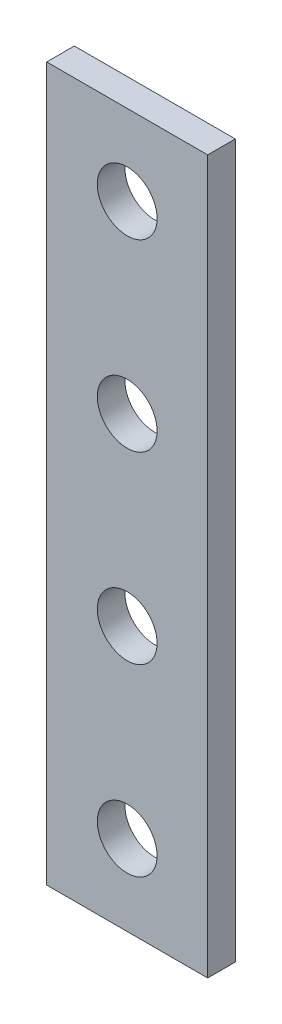
ISO-10303-21;
HEADER;
FILE_DESCRIPTION(('STEP AP214'),'2;1');
FILE_NAME('part.step','',(''),(''),'','','');
FILE_SCHEMA(('AUTOMOTIVE_DESIGN { 1 0 10303 214 1 1 1 1 }'));
ENDSEC;
DATA;
#1=APPLICATION_CONTEXT('core data for automotive mechanical design processes');
#2=APPLICATION_PROTOCOL_DEFINITION('international standard','automotive_design',2000,#1);
#3=PRODUCT_CONTEXT('',#1,'mechanical');
#4=PRODUCT('Part','Part','',(#3));
#5=PRODUCT_RELATED_PRODUCT_CATEGORY('part','',(#4));
#6=PRODUCT_DEFINITION_FORMATION('','',#4);
#7=PRODUCT_DEFINITION_CONTEXT('part definition',#1,'design');
#8=PRODUCT_DEFINITION('design','',#6,#7);
#9=PRODUCT_DEFINITION_SHAPE('','',#8);
#10=(LENGTH_UNIT() NAMED_UNIT(*) SI_UNIT(.MILLI.,.METRE.));
#11=(NAMED_UNIT(*) PLANE_ANGLE_UNIT() SI_UNIT($,.RADIAN.));
#12=(NAMED_UNIT(*) SI_UNIT($,.STERADIAN.) SOLID_ANGLE_UNIT());
#13=UNCERTAINTY_MEASURE_WITH_UNIT(LENGTH_MEASURE(1.E-05),#10,'distance_accuracy_value','');
#14=(GEOMETRIC_REPRESENTATION_CONTEXT(3) GLOBAL_UNCERTAINTY_ASSIGNED_CONTEXT((#13)) GLOBAL_UNIT_ASSIGNED_CONTEXT((#10,
#11,#12)) REPRESENTATION_CONTEXT('',''));
#15=CARTESIAN_POINT('',(0.,0.,0.));
#16=DIRECTION('',(0.,0.,1.));
#17=DIRECTION('',(1.,0.,0.));
#18=AXIS2_PLACEMENT_3D('',#15,#16,#17);
#19=CARTESIAN_POINT('',(35.,155.,12.));
#20=DIRECTION('',(-1.,0.,0.));
#21=DIRECTION('',(0.,-1.,0.));
#22=AXIS2_PLACEMENT_3D('',#19,#20,#21);
#23=PLANE('',#22);
#24=DIRECTION('',(0.,1.,0.));
#25=VECTOR('',#24,1.);
#26=CARTESIAN_POINT('',(35.,155.,0.));
#27=LINE('',#26,#25);
#28=CARTESIAN_POINT('',(35.,-155.,0.));
#29=VERTEX_POINT('',#28);
#30=CARTESIAN_POINT('',(35.,155.,0.));
#31=VERTEX_POINT('',#30);
#32=EDGE_CURVE('E103',#29,#31,#27,.T.);
#33=ORIENTED_EDGE('',*,*,#32,.T.);
#34=DIRECTION('',(0.,0.,-1.));
#35=VECTOR('',#34,1.);
#36=CARTESIAN_POINT('',(35.,155.,12.));
#37=LINE('',#36,#35);
#38=CARTESIAN_POINT('',(35.,155.,12.));
#39=VERTEX_POINT('',#38);
#40=EDGE_CURVE('E94',#39,#31,#37,.T.);
#41=ORIENTED_EDGE('',*,*,#40,.F.);
#42=DIRECTION('',(0.,1.,0.));
#43=VECTOR('',#42,1.);
#44=CARTESIAN_POINT('',(35.,155.,12.));
#45=LINE('',#44,#43);
#46=CARTESIAN_POINT('',(35.,-155.,12.));
#47=VERTEX_POINT('',#46);
#48=EDGE_CURVE('E88',#47,#39,#45,.T.);
#49=ORIENTED_EDGE('',*,*,#48,.F.);
#50=DIRECTION('',(0.,0.,-1.));
#51=VECTOR('',#50,1.);
#52=CARTESIAN_POINT('',(35.,-155.,12.));
#53=LINE('',#52,#51);
#54=EDGE_CURVE('E99',#47,#29,#53,.T.);
#55=ORIENTED_EDGE('',*,*,#54,.T.);
#56=EDGE_LOOP('',(#33,#41,#49,#55));
#57=FACE_BOUND('',#56,.T.);
#58=ADVANCED_FACE('F34',(#57),#23,.F.);
#59=CARTESIAN_POINT('',(-35.,155.,12.));
#60=DIRECTION('',(0.,-1.,0.));
#61=DIRECTION('',(0.,0.,-1.));
#62=AXIS2_PLACEMENT_3D('',#59,#60,#61);
#63=PLANE('',#62);
#64=DIRECTION('',(-1.,0.,0.));
#65=VECTOR('',#64,1.);
#66=CARTESIAN_POINT('',(-35.,155.,0.));
#67=LINE('',#66,#65);
#68=CARTESIAN_POINT('',(-35.,155.,0.));
#69=VERTEX_POINT('',#68);
#70=EDGE_CURVE('E93',#31,#69,#67,.T.);
#71=ORIENTED_EDGE('',*,*,#70,.T.);
#72=DIRECTION('',(0.,0.,-1.));
#73=VECTOR('',#72,1.);
#74=CARTESIAN_POINT('',(-35.,155.,12.));
#75=LINE('',#74,#73);
#76=CARTESIAN_POINT('',(-35.,155.,12.));
#77=VERTEX_POINT('',#76);
#78=EDGE_CURVE('E91',#77,#69,#75,.T.);
#79=ORIENTED_EDGE('',*,*,#78,.F.);
#80=DIRECTION('',(-1.,0.,0.));
#81=VECTOR('',#80,1.);
#82=CARTESIAN_POINT('',(-35.,155.,12.));
#83=LINE('',#82,#81);
#84=EDGE_CURVE('E82',#39,#77,#83,.T.);
#85=ORIENTED_EDGE('',*,*,#84,.F.);
#86=ORIENTED_EDGE('',*,*,#40,.T.);
#87=EDGE_LOOP('',(#71,#79,#85,#86));
#88=FACE_BOUND('',#87,.T.);
#89=ADVANCED_FACE('F92',(#88),#63,.F.);
#90=CARTESIAN_POINT('',(-35.,155.,12.));
#91=DIRECTION('',(1.,0.,0.));
#92=DIRECTION('',(0.,1.,0.));
#93=AXIS2_PLACEMENT_3D('',#90,#91,#92);
#94=PLANE('',#93);
#95=DIRECTION('',(0.,-1.,0.));
#96=VECTOR('',#95,1.);
#97=CARTESIAN_POINT('',(-35.,155.,0.));
#98=LINE('',#97,#96);
#99=CARTESIAN_POINT('',(-35.,-155.,0.));
#100=VERTEX_POINT('',#99);
#101=EDGE_CURVE('E68',#69,#100,#98,.T.);
#102=ORIENTED_EDGE('',*,*,#101,.T.);
#103=DIRECTION('',(0.,0.,-1.));
#104=VECTOR('',#103,1.);
#105=CARTESIAN_POINT('',(-35.,-155.,12.));
#106=LINE('',#105,#104);
#107=CARTESIAN_POINT('',(-35.,-155.,12.));
#108=VERTEX_POINT('',#107);
#109=EDGE_CURVE('E95',#108,#100,#106,.T.);
#110=ORIENTED_EDGE('',*,*,#109,.F.);
#111=DIRECTION('',(0.,-1.,0.));
#112=VECTOR('',#111,1.);
#113=CARTESIAN_POINT('',(-35.,155.,12.));
#114=LINE('',#113,#112);
#115=EDGE_CURVE('E86',#77,#108,#114,.T.);
#116=ORIENTED_EDGE('',*,*,#115,.F.);
#117=ORIENTED_EDGE('',*,*,#78,.T.);
#118=EDGE_LOOP('',(#102,#110,#116,#117));
#119=FACE_BOUND('',#118,.T.);
#120=ADVANCED_FACE('F97',(#119),#94,.F.);
#121=CARTESIAN_POINT('',(-35.,-155.,12.));
#122=DIRECTION('',(0.,1.,0.));
#123=DIRECTION('',(0.,0.,1.));
#124=AXIS2_PLACEMENT_3D('',#121,#122,#123);
#125=PLANE('',#124);
#126=DIRECTION('',(1.,0.,0.));
#127=VECTOR('',#126,1.);
#128=CARTESIAN_POINT('',(-35.,-155.,0.));
#129=LINE('',#128,#127);
#130=EDGE_CURVE('E74',#100,#29,#129,.T.);
#131=ORIENTED_EDGE('',*,*,#130,.T.);
#132=ORIENTED_EDGE('',*,*,#54,.F.);
#133=DIRECTION('',(1.,0.,0.));
#134=VECTOR('',#133,1.);
#135=CARTESIAN_POINT('',(-35.,-155.,12.));
#136=LINE('',#135,#134);
#137=EDGE_CURVE('E51',#108,#47,#136,.T.);
#138=ORIENTED_EDGE('',*,*,#137,.F.);
#139=ORIENTED_EDGE('',*,*,#109,.T.);
#140=EDGE_LOOP('',(#131,#132,#138,#139));
#141=FACE_BOUND('',#140,.T.);
#142=ADVANCED_FACE('F129',(#141),#125,.F.);
#143=CARTESIAN_POINT('',(35.,-155.,12.));
#144=DIRECTION('',(0.,0.,1.));
#145=DIRECTION('',(1.,0.,0.));
#146=AXIS2_PLACEMENT_3D('',#143,#144,#145);
#147=PLANE('',#146);
#148=CARTESIAN_POINT('',(0.,40.,12.));
#149=DIRECTION('',(0.,0.,1.));
#150=DIRECTION('',(1.,0.,0.));
#151=AXIS2_PLACEMENT_3D('',#148,#149,#150);
#152=CIRCLE('',#151,13.);
#153=CARTESIAN_POINT('',(13.,40.,12.));
#154=VERTEX_POINT('',#153);
#155=EDGE_CURVE('E172',#154,#154,#152,.T.);
#156=ORIENTED_EDGE('',*,*,#155,.F.);
#157=EDGE_LOOP('',(#156));
#158=FACE_BOUND('',#157,.T.);
#159=CARTESIAN_POINT('',(0.,120.,12.));
#160=DIRECTION('',(0.,0.,1.));
#161=DIRECTION('',(1.,0.,0.));
#162=AXIS2_PLACEMENT_3D('',#159,#160,#161);
#163=CIRCLE('',#162,13.);
#164=CARTESIAN_POINT('',(13.,120.,12.));
#165=VERTEX_POINT('',#164);
#166=EDGE_CURVE('E173',#165,#165,#163,.T.);
#167=ORIENTED_EDGE('',*,*,#166,.F.);
#168=EDGE_LOOP('',(#167));
#169=FACE_BOUND('',#168,.T.);
#170=ORIENTED_EDGE('',*,*,#48,.T.);
#171=ORIENTED_EDGE('',*,*,#84,.T.);
#172=ORIENTED_EDGE('',*,*,#115,.T.);
#173=ORIENTED_EDGE('',*,*,#137,.T.);
#174=EDGE_LOOP('',(#170,#171,#172,#173));
#175=FACE_BOUND('',#174,.T.);
#176=CARTESIAN_POINT('',(0.,-40.,12.));
#177=DIRECTION('',(0.,0.,1.));
#178=DIRECTION('',(1.,0.,0.));
#179=AXIS2_PLACEMENT_3D('',#176,#177,#178);
#180=CIRCLE('',#179,13.);
#181=CARTESIAN_POINT('',(13.,-40.,12.));
#182=VERTEX_POINT('',#181);
#183=EDGE_CURVE('E116',#182,#182,#180,.T.);
#184=ORIENTED_EDGE('',*,*,#183,.F.);
#185=EDGE_LOOP('',(#184));
#186=FACE_BOUND('',#185,.T.);
#187=CARTESIAN_POINT('',(0.,-120.,12.));
#188=DIRECTION('',(0.,0.,1.));
#189=DIRECTION('',(1.,0.,0.));
#190=AXIS2_PLACEMENT_3D('',#187,#188,#189);
#191=CIRCLE('',#190,13.);
#192=CARTESIAN_POINT('',(13.,-120.,12.));
#193=VERTEX_POINT('',#192);
#194=EDGE_CURVE('E11',#193,#193,#191,.T.);
#195=ORIENTED_EDGE('',*,*,#194,.F.);
#196=EDGE_LOOP('',(#195));
#197=FACE_BOUND('',#196,.T.);
#198=ADVANCED_FACE('F83',(#158,#169,#175,#186,#197),#147,.T.);
#199=CARTESIAN_POINT('',(35.,-155.,0.));
#200=DIRECTION('',(0.,0.,1.));
#201=DIRECTION('',(1.,0.,0.));
#202=AXIS2_PLACEMENT_3D('',#199,#200,#201);
#203=PLANE('',#202);
#204=CARTESIAN_POINT('',(0.,40.,0.));
#205=DIRECTION('',(0.,0.,1.));
#206=DIRECTION('',(1.,0.,0.));
#207=AXIS2_PLACEMENT_3D('',#204,#205,#206);
#208=CIRCLE('',#207,13.);
#209=CARTESIAN_POINT('',(13.,40.,0.));
#210=VERTEX_POINT('',#209);
#211=EDGE_CURVE('E170',#210,#210,#208,.T.);
#212=ORIENTED_EDGE('',*,*,#211,.T.);
#213=EDGE_LOOP('',(#212));
#214=FACE_BOUND('',#213,.T.);
#215=CARTESIAN_POINT('',(0.,120.,0.));
#216=DIRECTION('',(0.,0.,1.));
#217=DIRECTION('',(1.,0.,0.));
#218=AXIS2_PLACEMENT_3D('',#215,#216,#217);
#219=CIRCLE('',#218,13.);
#220=CARTESIAN_POINT('',(13.,120.,0.));
#221=VERTEX_POINT('',#220);
#222=EDGE_CURVE('E106',#221,#221,#219,.T.);
#223=ORIENTED_EDGE('',*,*,#222,.T.);
#224=EDGE_LOOP('',(#223));
#225=FACE_BOUND('',#224,.T.);
#226=ORIENTED_EDGE('',*,*,#32,.F.);
#227=ORIENTED_EDGE('',*,*,#130,.F.);
#228=ORIENTED_EDGE('',*,*,#101,.F.);
#229=ORIENTED_EDGE('',*,*,#70,.F.);
#230=EDGE_LOOP('',(#226,#227,#228,#229));
#231=FACE_BOUND('',#230,.T.);
#232=CARTESIAN_POINT('',(0.,-40.,0.));
#233=DIRECTION('',(0.,0.,1.));
#234=DIRECTION('',(1.,0.,0.));
#235=AXIS2_PLACEMENT_3D('',#232,#233,#234);
#236=CIRCLE('',#235,13.);
#237=CARTESIAN_POINT('',(13.,-40.,0.));
#238=VERTEX_POINT('',#237);
#239=EDGE_CURVE('E113',#238,#238,#236,.T.);
#240=ORIENTED_EDGE('',*,*,#239,.T.);
#241=EDGE_LOOP('',(#240));
#242=FACE_BOUND('',#241,.T.);
#243=CARTESIAN_POINT('',(0.,-120.,0.));
#244=DIRECTION('',(0.,0.,1.));
#245=DIRECTION('',(1.,0.,0.));
#246=AXIS2_PLACEMENT_3D('',#243,#244,#245);
#247=CIRCLE('',#246,13.);
#248=CARTESIAN_POINT('',(13.,-120.,0.));
#249=VERTEX_POINT('',#248);
#250=EDGE_CURVE('E43',#249,#249,#247,.T.);
#251=ORIENTED_EDGE('',*,*,#250,.T.);
#252=EDGE_LOOP('',(#251));
#253=FACE_BOUND('',#252,.T.);
#254=ADVANCED_FACE('F121',(#214,#225,#231,#242,#253),#203,.F.);
#255=CARTESIAN_POINT('',(0.,120.,0.));
#256=DIRECTION('',(0.,0.,1.));
#257=DIRECTION('',(1.,0.,0.));
#258=AXIS2_PLACEMENT_3D('',#255,#256,#257);
#259=CYLINDRICAL_SURFACE('',#258,13.);
#260=ORIENTED_EDGE('',*,*,#222,.F.);
#261=EDGE_LOOP('',(#260));
#262=FACE_BOUND('',#261,.T.);
#263=ORIENTED_EDGE('',*,*,#166,.T.);
#264=EDGE_LOOP('',(#263));
#265=FACE_BOUND('',#264,.T.);
#266=ADVANCED_FACE('F136',(#262,#265),#259,.F.);
#267=CARTESIAN_POINT('',(0.,40.,0.));
#268=DIRECTION('',(0.,0.,1.));
#269=DIRECTION('',(1.,0.,0.));
#270=AXIS2_PLACEMENT_3D('',#267,#268,#269);
#271=CYLINDRICAL_SURFACE('',#270,13.);
#272=ORIENTED_EDGE('',*,*,#211,.F.);
#273=EDGE_LOOP('',(#272));
#274=FACE_BOUND('',#273,.T.);
#275=ORIENTED_EDGE('',*,*,#155,.T.);
#276=EDGE_LOOP('',(#275));
#277=FACE_BOUND('',#276,.T.);
#278=ADVANCED_FACE('F152',(#274,#277),#271,.F.);
#279=CARTESIAN_POINT('',(0.,-40.,0.));
#280=DIRECTION('',(0.,0.,1.));
#281=DIRECTION('',(1.,0.,0.));
#282=AXIS2_PLACEMENT_3D('',#279,#280,#281);
#283=CYLINDRICAL_SURFACE('',#282,13.);
#284=ORIENTED_EDGE('',*,*,#239,.F.);
#285=EDGE_LOOP('',(#284));
#286=FACE_BOUND('',#285,.T.);
#287=ORIENTED_EDGE('',*,*,#183,.T.);
#288=EDGE_LOOP('',(#287));
#289=FACE_BOUND('',#288,.T.);
#290=ADVANCED_FACE('F125',(#286,#289),#283,.F.);
#291=CARTESIAN_POINT('',(0.,-120.,0.));
#292=DIRECTION('',(0.,0.,1.));
#293=DIRECTION('',(1.,0.,0.));
#294=AXIS2_PLACEMENT_3D('',#291,#292,#293);
#295=CYLINDRICAL_SURFACE('',#294,13.);
#296=ORIENTED_EDGE('',*,*,#250,.F.);
#297=EDGE_LOOP('',(#296));
#298=FACE_BOUND('',#297,.T.);
#299=ORIENTED_EDGE('',*,*,#194,.T.);
#300=EDGE_LOOP('',(#299));
#301=FACE_BOUND('',#300,.T.);
#302=ADVANCED_FACE('F36',(#298,#301),#295,.F.);
#303=CLOSED_SHELL('',(#58,#89,#120,#142,#198,#254,#266,#278,#290,#302));
#304=MANIFOLD_SOLID_BREP('B2',#303);
#305=ADVANCED_BREP_SHAPE_REPRESENTATION('',(#18,#304),#14);
#306=SHAPE_DEFINITION_REPRESENTATION(#9,#305);
ENDSEC;
END-ISO-10303-21;
